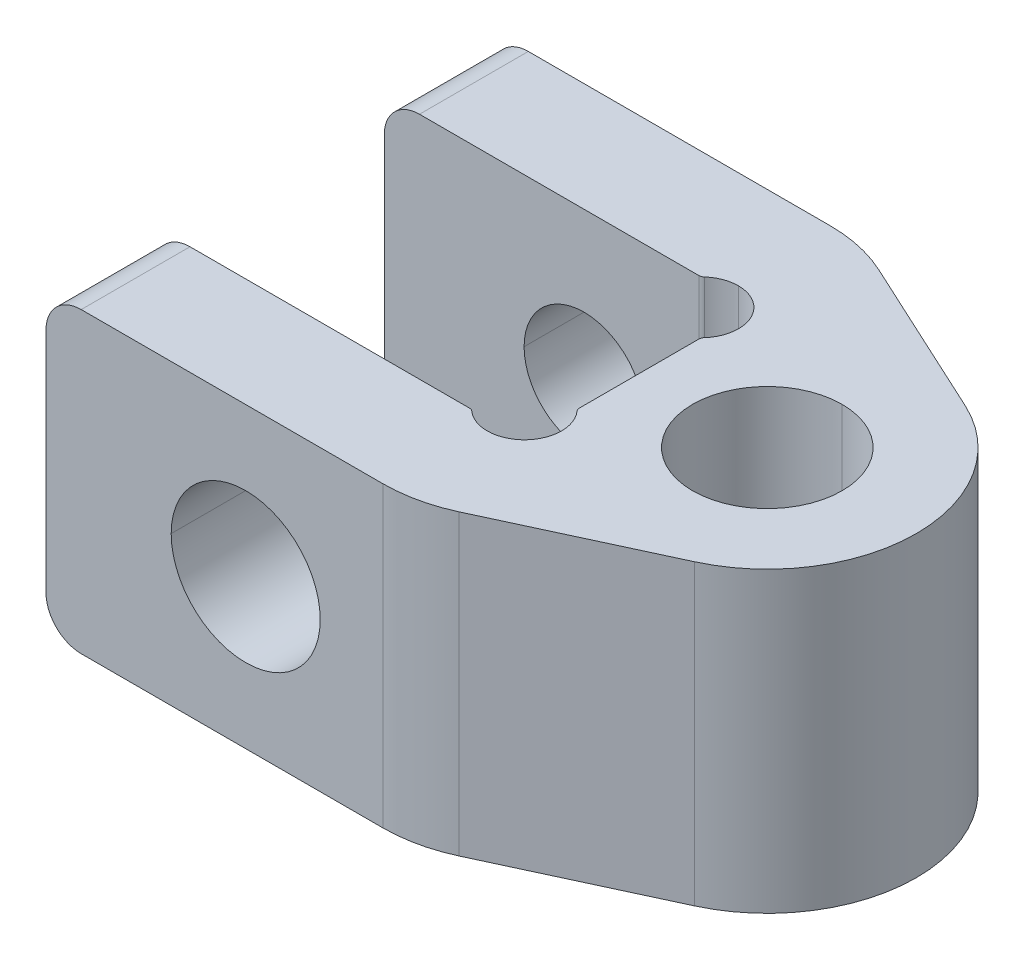
ISO-10303-21;
HEADER;
FILE_DESCRIPTION(('STEP AP214'),'2;1');
FILE_NAME('part.step','',(''),(''),'','','');
FILE_SCHEMA(('AUTOMOTIVE_DESIGN { 1 0 10303 214 1 1 1 1 }'));
ENDSEC;
DATA;
#1=APPLICATION_CONTEXT('core data for automotive mechanical design processes');
#2=APPLICATION_PROTOCOL_DEFINITION('international standard','automotive_design',2000,#1);
#3=PRODUCT_CONTEXT('',#1,'mechanical');
#4=PRODUCT('Part','Part','',(#3));
#5=PRODUCT_RELATED_PRODUCT_CATEGORY('part','',(#4));
#6=PRODUCT_DEFINITION_FORMATION('','',#4);
#7=PRODUCT_DEFINITION_CONTEXT('part definition',#1,'design');
#8=PRODUCT_DEFINITION('design','',#6,#7);
#9=PRODUCT_DEFINITION_SHAPE('','',#8);
#10=(LENGTH_UNIT() NAMED_UNIT(*) SI_UNIT(.MILLI.,.METRE.));
#11=(NAMED_UNIT(*) PLANE_ANGLE_UNIT() SI_UNIT($,.RADIAN.));
#12=(NAMED_UNIT(*) SI_UNIT($,.STERADIAN.) SOLID_ANGLE_UNIT());
#13=UNCERTAINTY_MEASURE_WITH_UNIT(LENGTH_MEASURE(1.E-05),#10,'distance_accuracy_value','');
#14=(GEOMETRIC_REPRESENTATION_CONTEXT(3) GLOBAL_UNCERTAINTY_ASSIGNED_CONTEXT((#13)) GLOBAL_UNIT_ASSIGNED_CONTEXT((#10,
#11,#12)) REPRESENTATION_CONTEXT('',''));
#15=CARTESIAN_POINT('',(0.,0.,0.));
#16=DIRECTION('',(0.,0.,1.));
#17=DIRECTION('',(1.,0.,0.));
#18=AXIS2_PLACEMENT_3D('',#15,#16,#17);
#19=CARTESIAN_POINT('',(0.,0.,-9.525));
#20=DIRECTION('',(0.,0.,-1.));
#21=DIRECTION('',(-1.,0.,0.));
#22=AXIS2_PLACEMENT_3D('',#19,#20,#21);
#23=CYLINDRICAL_SURFACE('',#22,2.5527);
#24=DIRECTION('',(0.,0.,-1.));
#25=VECTOR('',#24,1.);
#26=CARTESIAN_POINT('',(2.5527,0.,-9.525));
#27=LINE('',#26,#25);
#28=CARTESIAN_POINT('',(2.5527,0.,-4.8895));
#29=VERTEX_POINT('',#28);
#30=CARTESIAN_POINT('',(2.5527,0.,-9.525));
#31=VERTEX_POINT('',#30);
#32=EDGE_CURVE('E285',#29,#31,#27,.T.);
#33=ORIENTED_EDGE('',*,*,#32,.F.);
#34=CARTESIAN_POINT('',(0.,0.,-4.8895));
#35=DIRECTION('',(0.,0.,-1.));
#36=DIRECTION('',(-1.,0.,0.));
#37=AXIS2_PLACEMENT_3D('',#34,#35,#36);
#38=CIRCLE('',#37,2.5527);
#39=CARTESIAN_POINT('',(-2.5527,0.,-4.8895));
#40=VERTEX_POINT('',#39);
#41=EDGE_CURVE('E448',#40,#29,#38,.T.);
#42=ORIENTED_EDGE('',*,*,#41,.F.);
#43=DIRECTION('',(0.,0.,-1.));
#44=VECTOR('',#43,1.);
#45=CARTESIAN_POINT('',(-2.5527,0.,-9.525));
#46=LINE('',#45,#44);
#47=CARTESIAN_POINT('',(-2.5527,0.,-9.525));
#48=VERTEX_POINT('',#47);
#49=EDGE_CURVE('E352',#40,#48,#46,.T.);
#50=ORIENTED_EDGE('',*,*,#49,.T.);
#51=CARTESIAN_POINT('',(0.,0.,-9.525));
#52=DIRECTION('',(0.,0.,-1.));
#53=DIRECTION('',(-1.,0.,0.));
#54=AXIS2_PLACEMENT_3D('',#51,#52,#53);
#55=CIRCLE('',#54,2.5527);
#56=EDGE_CURVE('E259',#48,#31,#55,.T.);
#57=ORIENTED_EDGE('',*,*,#56,.T.);
#58=EDGE_LOOP('',(#33,#42,#50,#57));
#59=FACE_BOUND('',#58,.T.);
#60=ADVANCED_FACE('F16',(#59),#23,.F.);
#61=CARTESIAN_POINT('',(5.8406491909149,6.35,-3.175));
#62=DIRECTION('',(0.,-1.,0.));
#63=DIRECTION('',(0.,0.,-1.));
#64=AXIS2_PLACEMENT_3D('',#61,#62,#63);
#65=CYLINDRICAL_SURFACE('',#64,6.35);
#66=CARTESIAN_POINT('',(5.8406491909149,6.35,-3.175));
#67=DIRECTION('',(0.,1.,0.));
#68=DIRECTION('',(0.,0.,1.));
#69=AXIS2_PLACEMENT_3D('',#66,#67,#68);
#70=CIRCLE('',#69,6.35);
#71=CARTESIAN_POINT('',(8.50800118919866,6.35,-8.93761514568269));
#72=VERTEX_POINT('',#71);
#73=CARTESIAN_POINT('',(5.8406491909149,6.35,-9.525));
#74=VERTEX_POINT('',#73);
#75=EDGE_CURVE('E248',#72,#74,#70,.T.);
#76=ORIENTED_EDGE('',*,*,#75,.F.);
#77=DIRECTION('',(0.,1.,0.));
#78=VECTOR('',#77,1.);
#79=CARTESIAN_POINT('',(8.50800118919866,6.35,-8.93761514568269));
#80=LINE('',#79,#78);
#81=CARTESIAN_POINT('',(8.50800118919866,-6.35,-8.93761514568269));
#82=VERTEX_POINT('',#81);
#83=EDGE_CURVE('E20',#82,#72,#80,.T.);
#84=ORIENTED_EDGE('',*,*,#83,.F.);
#85=CARTESIAN_POINT('',(5.8406491909149,-6.35,-3.175));
#86=DIRECTION('',(0.,-1.,0.));
#87=DIRECTION('',(0.,0.,1.));
#88=AXIS2_PLACEMENT_3D('',#85,#86,#87);
#89=CIRCLE('',#88,6.35);
#90=CARTESIAN_POINT('',(5.8406491909149,-6.35,-9.525));
#91=VERTEX_POINT('',#90);
#92=EDGE_CURVE('E10',#91,#82,#89,.T.);
#93=ORIENTED_EDGE('',*,*,#92,.F.);
#94=DIRECTION('',(0.,-1.,0.));
#95=VECTOR('',#94,1.);
#96=CARTESIAN_POINT('',(5.8406491909149,6.35,-9.525));
#97=LINE('',#96,#95);
#98=EDGE_CURVE('E266',#74,#91,#97,.T.);
#99=ORIENTED_EDGE('',*,*,#98,.F.);
#100=EDGE_LOOP('',(#76,#84,#93,#99));
#101=FACE_BOUND('',#100,.T.);
#102=ADVANCED_FACE('F617',(#101),#65,.T.);
#103=CARTESIAN_POINT('',(5.84064919091489,6.35,3.175));
#104=DIRECTION('',(0.,-1.,0.));
#105=DIRECTION('',(0.,0.,-1.));
#106=AXIS2_PLACEMENT_3D('',#103,#104,#105);
#107=CYLINDRICAL_SURFACE('',#106,6.35);
#108=CARTESIAN_POINT('',(5.84064919091489,6.35,3.175));
#109=DIRECTION('',(0.,1.,0.));
#110=DIRECTION('',(0.,0.,1.));
#111=AXIS2_PLACEMENT_3D('',#108,#109,#110);
#112=CIRCLE('',#111,6.35);
#113=CARTESIAN_POINT('',(5.84064919091489,6.35,9.525));
#114=VERTEX_POINT('',#113);
#115=CARTESIAN_POINT('',(8.50800118919866,6.35,8.9376151456827));
#116=VERTEX_POINT('',#115);
#117=EDGE_CURVE('E197',#114,#116,#112,.T.);
#118=ORIENTED_EDGE('',*,*,#117,.F.);
#119=DIRECTION('',(0.,1.,0.));
#120=VECTOR('',#119,1.);
#121=CARTESIAN_POINT('',(5.84064919091489,6.35,9.525));
#122=LINE('',#121,#120);
#123=CARTESIAN_POINT('',(5.84064919091489,-6.35,9.525));
#124=VERTEX_POINT('',#123);
#125=EDGE_CURVE('E323',#124,#114,#122,.T.);
#126=ORIENTED_EDGE('',*,*,#125,.F.);
#127=CARTESIAN_POINT('',(5.84064919091489,-6.35,3.175));
#128=DIRECTION('',(0.,-1.,0.));
#129=DIRECTION('',(0.,0.,1.));
#130=AXIS2_PLACEMENT_3D('',#127,#128,#129);
#131=CIRCLE('',#130,6.35);
#132=CARTESIAN_POINT('',(8.50800118919866,-6.35,8.9376151456827));
#133=VERTEX_POINT('',#132);
#134=EDGE_CURVE('E212',#133,#124,#131,.T.);
#135=ORIENTED_EDGE('',*,*,#134,.F.);
#136=DIRECTION('',(0.,-1.,0.));
#137=VECTOR('',#136,1.);
#138=CARTESIAN_POINT('',(8.50800118919866,6.35,8.9376151456827));
#139=LINE('',#138,#137);
#140=EDGE_CURVE('E412',#116,#133,#139,.T.);
#141=ORIENTED_EDGE('',*,*,#140,.F.);
#142=EDGE_LOOP('',(#118,#126,#135,#141));
#143=FACE_BOUND('',#142,.T.);
#144=ADVANCED_FACE('F549',(#143),#107,.T.);
#145=CARTESIAN_POINT('',(7.489,6.35,-2.54526338987083));
#146=DIRECTION('',(0.,-1.,0.));
#147=DIRECTION('',(0.,0.,-1.));
#148=AXIS2_PLACEMENT_3D('',#145,#146,#147);
#149=CYLINDRICAL_SURFACE('',#148,0.25);
#150=CARTESIAN_POINT('',(7.489,6.35,-2.54526338987083));
#151=DIRECTION('',(0.,1.,0.));
#152=DIRECTION('',(0.,0.,1.));
#153=AXIS2_PLACEMENT_3D('',#150,#151,#152);
#154=CIRCLE('',#153,0.25);
#155=CARTESIAN_POINT('',(7.30226095032195,6.35,-2.71148170211512));
#156=VERTEX_POINT('',#155);
#157=CARTESIAN_POINT('',(7.239,6.35,-2.54526338987083));
#158=VERTEX_POINT('',#157);
#159=EDGE_CURVE('E42',#156,#158,#154,.T.);
#160=ORIENTED_EDGE('',*,*,#159,.F.);
#161=DIRECTION('',(0.,1.,0.));
#162=VECTOR('',#161,1.);
#163=CARTESIAN_POINT('',(7.30226095032195,6.35,-2.71148170211512));
#164=LINE('',#163,#162);
#165=CARTESIAN_POINT('',(7.30226095032195,-6.35,-2.71148170211512));
#166=VERTEX_POINT('',#165);
#167=EDGE_CURVE('E290',#166,#156,#164,.T.);
#168=ORIENTED_EDGE('',*,*,#167,.F.);
#169=CARTESIAN_POINT('',(7.489,-6.35,-2.54526338987083));
#170=DIRECTION('',(0.,-1.,0.));
#171=DIRECTION('',(0.,0.,1.));
#172=AXIS2_PLACEMENT_3D('',#169,#170,#171);
#173=CIRCLE('',#172,0.25);
#174=CARTESIAN_POINT('',(7.239,-6.35,-2.54526338987083));
#175=VERTEX_POINT('',#174);
#176=EDGE_CURVE('E392',#175,#166,#173,.T.);
#177=ORIENTED_EDGE('',*,*,#176,.F.);
#178=DIRECTION('',(0.,-1.,0.));
#179=VECTOR('',#178,1.);
#180=CARTESIAN_POINT('',(7.239,-6.35,-2.54526338987083));
#181=LINE('',#180,#179);
#182=EDGE_CURVE('E289',#158,#175,#181,.T.);
#183=ORIENTED_EDGE('',*,*,#182,.F.);
#184=EDGE_LOOP('',(#160,#168,#177,#183));
#185=FACE_BOUND('',#184,.T.);
#186=ADVANCED_FACE('F1001',(#185),#149,.T.);
#187=CARTESIAN_POINT('',(7.489,6.35,2.54526338987083));
#188=DIRECTION('',(0.,-1.,0.));
#189=DIRECTION('',(0.,0.,-1.));
#190=AXIS2_PLACEMENT_3D('',#187,#188,#189);
#191=CYLINDRICAL_SURFACE('',#190,0.25);
#192=CARTESIAN_POINT('',(7.489,6.35,2.54526338987083));
#193=DIRECTION('',(0.,1.,0.));
#194=DIRECTION('',(0.,0.,1.));
#195=AXIS2_PLACEMENT_3D('',#192,#193,#194);
#196=CIRCLE('',#195,0.25);
#197=CARTESIAN_POINT('',(7.239,6.35,2.54526338987083));
#198=VERTEX_POINT('',#197);
#199=CARTESIAN_POINT('',(7.30226095032195,6.35,2.71148170211512));
#200=VERTEX_POINT('',#199);
#201=EDGE_CURVE('E383',#198,#200,#196,.T.);
#202=ORIENTED_EDGE('',*,*,#201,.F.);
#203=DIRECTION('',(0.,1.,0.));
#204=VECTOR('',#203,1.);
#205=CARTESIAN_POINT('',(7.239,6.35,2.54526338987083));
#206=LINE('',#205,#204);
#207=CARTESIAN_POINT('',(7.239,-6.35,2.54526338987083));
#208=VERTEX_POINT('',#207);
#209=EDGE_CURVE('E480',#208,#198,#206,.T.);
#210=ORIENTED_EDGE('',*,*,#209,.F.);
#211=CARTESIAN_POINT('',(7.489,-6.35,2.54526338987083));
#212=DIRECTION('',(0.,-1.,0.));
#213=DIRECTION('',(0.,0.,1.));
#214=AXIS2_PLACEMENT_3D('',#211,#212,#213);
#215=CIRCLE('',#214,0.25);
#216=CARTESIAN_POINT('',(7.30226095032195,-6.35,2.71148170211512));
#217=VERTEX_POINT('',#216);
#218=EDGE_CURVE('E416',#217,#208,#215,.T.);
#219=ORIENTED_EDGE('',*,*,#218,.F.);
#220=DIRECTION('',(0.,-1.,0.));
#221=VECTOR('',#220,1.);
#222=CARTESIAN_POINT('',(7.30226095032195,6.35,2.71148170211512));
#223=LINE('',#222,#221);
#224=EDGE_CURVE('E423',#200,#217,#223,.T.);
#225=ORIENTED_EDGE('',*,*,#224,.F.);
#226=EDGE_LOOP('',(#202,#210,#219,#225));
#227=FACE_BOUND('',#226,.T.);
#228=ADVANCED_FACE('F997',(#227),#191,.T.);
#229=CARTESIAN_POINT('',(4.89476338987083,6.35,-5.1395));
#230=DIRECTION('',(0.,-1.,0.));
#231=DIRECTION('',(0.,0.,-1.));
#232=AXIS2_PLACEMENT_3D('',#229,#230,#231);
#233=CYLINDRICAL_SURFACE('',#232,0.25);
#234=CARTESIAN_POINT('',(4.89476338987083,6.35,-5.1395));
#235=DIRECTION('',(0.,1.,0.));
#236=DIRECTION('',(0.,0.,1.));
#237=AXIS2_PLACEMENT_3D('',#234,#235,#236);
#238=CIRCLE('',#237,0.25);
#239=CARTESIAN_POINT('',(4.89476338987083,6.35,-4.8895));
#240=VERTEX_POINT('',#239);
#241=CARTESIAN_POINT('',(5.06098170211512,6.35,-4.95276095032195));
#242=VERTEX_POINT('',#241);
#243=EDGE_CURVE('E247',#240,#242,#238,.T.);
#244=ORIENTED_EDGE('',*,*,#243,.F.);
#245=DIRECTION('',(0.,1.,0.));
#246=VECTOR('',#245,1.);
#247=CARTESIAN_POINT('',(4.89476338987083,6.35,-4.8895));
#248=LINE('',#247,#246);
#249=CARTESIAN_POINT('',(4.89476338987083,-6.35,-4.8895));
#250=VERTEX_POINT('',#249);
#251=EDGE_CURVE('E351',#250,#240,#248,.T.);
#252=ORIENTED_EDGE('',*,*,#251,.F.);
#253=CARTESIAN_POINT('',(4.89476338987083,-6.35,-5.1395));
#254=DIRECTION('',(0.,-1.,0.));
#255=DIRECTION('',(0.,0.,1.));
#256=AXIS2_PLACEMENT_3D('',#253,#254,#255);
#257=CIRCLE('',#256,0.25);
#258=CARTESIAN_POINT('',(5.06098170211512,-6.35,-4.95276095032195));
#259=VERTEX_POINT('',#258);
#260=EDGE_CURVE('E389',#259,#250,#257,.T.);
#261=ORIENTED_EDGE('',*,*,#260,.F.);
#262=DIRECTION('',(0.,-1.,0.));
#263=VECTOR('',#262,1.);
#264=CARTESIAN_POINT('',(5.06098170211512,6.35,-4.95276095032195));
#265=LINE('',#264,#263);
#266=EDGE_CURVE('E473',#242,#259,#265,.T.);
#267=ORIENTED_EDGE('',*,*,#266,.F.);
#268=EDGE_LOOP('',(#244,#252,#261,#267));
#269=FACE_BOUND('',#268,.T.);
#270=ADVANCED_FACE('F938',(#269),#233,.T.);
#271=CARTESIAN_POINT('',(4.89476338987083,6.35,5.1395));
#272=DIRECTION('',(0.,-1.,0.));
#273=DIRECTION('',(0.,0.,-1.));
#274=AXIS2_PLACEMENT_3D('',#271,#272,#273);
#275=CYLINDRICAL_SURFACE('',#274,0.25);
#276=CARTESIAN_POINT('',(4.89476338987083,6.35,5.1395));
#277=DIRECTION('',(0.,1.,0.));
#278=DIRECTION('',(0.,0.,1.));
#279=AXIS2_PLACEMENT_3D('',#276,#277,#278);
#280=CIRCLE('',#279,0.25);
#281=CARTESIAN_POINT('',(5.06098170211512,6.35,4.95276095032195));
#282=VERTEX_POINT('',#281);
#283=CARTESIAN_POINT('',(4.89476338987083,6.35,4.8895));
#284=VERTEX_POINT('',#283);
#285=EDGE_CURVE('E379',#282,#284,#280,.T.);
#286=ORIENTED_EDGE('',*,*,#285,.F.);
#287=DIRECTION('',(0.,1.,0.));
#288=VECTOR('',#287,1.);
#289=CARTESIAN_POINT('',(5.06098170211512,6.35,4.95276095032195));
#290=LINE('',#289,#288);
#291=CARTESIAN_POINT('',(5.06098170211512,-6.35,4.95276095032195));
#292=VERTEX_POINT('',#291);
#293=EDGE_CURVE('E304',#292,#282,#290,.T.);
#294=ORIENTED_EDGE('',*,*,#293,.F.);
#295=CARTESIAN_POINT('',(4.89476338987083,-6.35,5.1395));
#296=DIRECTION('',(0.,-1.,0.));
#297=DIRECTION('',(0.,0.,1.));
#298=AXIS2_PLACEMENT_3D('',#295,#296,#297);
#299=CIRCLE('',#298,0.25);
#300=CARTESIAN_POINT('',(4.89476338987083,-6.35,4.8895));
#301=VERTEX_POINT('',#300);
#302=EDGE_CURVE('E452',#301,#292,#299,.T.);
#303=ORIENTED_EDGE('',*,*,#302,.F.);
#304=DIRECTION('',(0.,-1.,0.));
#305=VECTOR('',#304,1.);
#306=CARTESIAN_POINT('',(4.89476338987083,-6.35,4.8895));
#307=LINE('',#306,#305);
#308=EDGE_CURVE('E393',#284,#301,#307,.T.);
#309=ORIENTED_EDGE('',*,*,#308,.F.);
#310=EDGE_LOOP('',(#286,#294,#303,#309));
#311=FACE_BOUND('',#310,.T.);
#312=ADVANCED_FACE('F933',(#311),#275,.T.);
#313=CARTESIAN_POINT('',(-7.009,4.85,0.));
#314=DIRECTION('',(0.,0.,-1.));
#315=DIRECTION('',(-1.,0.,0.));
#316=AXIS2_PLACEMENT_3D('',#313,#314,#315);
#317=CYLINDRICAL_SURFACE('',#316,1.5);
#318=CARTESIAN_POINT('',(-7.009,4.85,-9.525));
#319=DIRECTION('',(0.,0.,-1.));
#320=DIRECTION('',(1.,0.,0.));
#321=AXIS2_PLACEMENT_3D('',#318,#319,#320);
#322=CIRCLE('',#321,1.5);
#323=CARTESIAN_POINT('',(-8.509,4.85,-9.525));
#324=VERTEX_POINT('',#323);
#325=CARTESIAN_POINT('',(-7.009,6.35,-9.525));
#326=VERTEX_POINT('',#325);
#327=EDGE_CURVE('E239',#324,#326,#322,.T.);
#328=ORIENTED_EDGE('',*,*,#327,.F.);
#329=DIRECTION('',(0.,0.,-1.));
#330=VECTOR('',#329,1.);
#331=CARTESIAN_POINT('',(-8.509,4.85,-9.525));
#332=LINE('',#331,#330);
#333=CARTESIAN_POINT('',(-8.509,4.85,-4.8895));
#334=VERTEX_POINT('',#333);
#335=EDGE_CURVE('E440',#334,#324,#332,.T.);
#336=ORIENTED_EDGE('',*,*,#335,.F.);
#337=CARTESIAN_POINT('',(-7.009,4.85,-4.8895));
#338=DIRECTION('',(0.,0.,1.));
#339=DIRECTION('',(-1.,0.,0.));
#340=AXIS2_PLACEMENT_3D('',#337,#338,#339);
#341=CIRCLE('',#340,1.5);
#342=CARTESIAN_POINT('',(-7.009,6.35,-4.8895));
#343=VERTEX_POINT('',#342);
#344=EDGE_CURVE('E242',#343,#334,#341,.T.);
#345=ORIENTED_EDGE('',*,*,#344,.F.);
#346=DIRECTION('',(0.,0.,1.));
#347=VECTOR('',#346,1.);
#348=CARTESIAN_POINT('',(-7.009,6.35,-4.8895));
#349=LINE('',#348,#347);
#350=EDGE_CURVE('E235',#326,#343,#349,.T.);
#351=ORIENTED_EDGE('',*,*,#350,.F.);
#352=EDGE_LOOP('',(#328,#336,#345,#351));
#353=FACE_BOUND('',#352,.T.);
#354=ADVANCED_FACE('F237',(#353),#317,.T.);
#355=CARTESIAN_POINT('',(-7.009,-4.85,0.));
#356=DIRECTION('',(0.,0.,1.));
#357=DIRECTION('',(1.,0.,0.));
#358=AXIS2_PLACEMENT_3D('',#355,#356,#357);
#359=CYLINDRICAL_SURFACE('',#358,1.5);
#360=CARTESIAN_POINT('',(-7.009,-4.85,-9.525));
#361=DIRECTION('',(0.,0.,-1.));
#362=DIRECTION('',(1.,0.,0.));
#363=AXIS2_PLACEMENT_3D('',#360,#361,#362);
#364=CIRCLE('',#363,1.5);
#365=CARTESIAN_POINT('',(-7.009,-6.35,-9.525));
#366=VERTEX_POINT('',#365);
#367=CARTESIAN_POINT('',(-8.509,-4.85,-9.525));
#368=VERTEX_POINT('',#367);
#369=EDGE_CURVE('E346',#366,#368,#364,.T.);
#370=ORIENTED_EDGE('',*,*,#369,.F.);
#371=DIRECTION('',(0.,0.,-1.));
#372=VECTOR('',#371,1.);
#373=CARTESIAN_POINT('',(-7.009,-6.35,0.));
#374=LINE('',#373,#372);
#375=CARTESIAN_POINT('',(-7.009,-6.35,-4.8895));
#376=VERTEX_POINT('',#375);
#377=EDGE_CURVE('E27',#376,#366,#374,.T.);
#378=ORIENTED_EDGE('',*,*,#377,.F.);
#379=CARTESIAN_POINT('',(-7.009,-4.85,-4.8895));
#380=DIRECTION('',(0.,0.,1.));
#381=DIRECTION('',(-1.,0.,0.));
#382=AXIS2_PLACEMENT_3D('',#379,#380,#381);
#383=CIRCLE('',#382,1.5);
#384=CARTESIAN_POINT('',(-8.509,-4.85,-4.8895));
#385=VERTEX_POINT('',#384);
#386=EDGE_CURVE('E326',#385,#376,#383,.T.);
#387=ORIENTED_EDGE('',*,*,#386,.F.);
#388=DIRECTION('',(0.,0.,1.));
#389=VECTOR('',#388,1.);
#390=CARTESIAN_POINT('',(-8.509,-4.85,0.));
#391=LINE('',#390,#389);
#392=EDGE_CURVE('E328',#368,#385,#391,.T.);
#393=ORIENTED_EDGE('',*,*,#392,.F.);
#394=EDGE_LOOP('',(#370,#378,#387,#393));
#395=FACE_BOUND('',#394,.T.);
#396=ADVANCED_FACE('F595',(#395),#359,.T.);
#397=CARTESIAN_POINT('',(-7.009,4.85,0.));
#398=DIRECTION('',(0.,0.,-1.));
#399=DIRECTION('',(-1.,0.,0.));
#400=AXIS2_PLACEMENT_3D('',#397,#398,#399);
#401=CYLINDRICAL_SURFACE('',#400,1.5);
#402=CARTESIAN_POINT('',(-7.009,4.85,4.8895));
#403=DIRECTION('',(0.,0.,-1.));
#404=DIRECTION('',(1.,0.,0.));
#405=AXIS2_PLACEMENT_3D('',#402,#403,#404);
#406=CIRCLE('',#405,1.5);
#407=CARTESIAN_POINT('',(-8.509,4.85,4.8895));
#408=VERTEX_POINT('',#407);
#409=CARTESIAN_POINT('',(-7.009,6.35,4.8895));
#410=VERTEX_POINT('',#409);
#411=EDGE_CURVE('E401',#408,#410,#406,.T.);
#412=ORIENTED_EDGE('',*,*,#411,.F.);
#413=DIRECTION('',(0.,0.,-1.));
#414=VECTOR('',#413,1.);
#415=CARTESIAN_POINT('',(-8.509,4.85,4.8895));
#416=LINE('',#415,#414);
#417=CARTESIAN_POINT('',(-8.509,4.85,9.525));
#418=VERTEX_POINT('',#417);
#419=EDGE_CURVE('E388',#418,#408,#416,.T.);
#420=ORIENTED_EDGE('',*,*,#419,.F.);
#421=CARTESIAN_POINT('',(-7.009,4.85,9.525));
#422=DIRECTION('',(0.,0.,1.));
#423=DIRECTION('',(-1.,0.,0.));
#424=AXIS2_PLACEMENT_3D('',#421,#422,#423);
#425=CIRCLE('',#424,1.5);
#426=CARTESIAN_POINT('',(-7.009,6.35,9.525));
#427=VERTEX_POINT('',#426);
#428=EDGE_CURVE('E322',#427,#418,#425,.T.);
#429=ORIENTED_EDGE('',*,*,#428,.F.);
#430=DIRECTION('',(0.,0.,1.));
#431=VECTOR('',#430,1.);
#432=CARTESIAN_POINT('',(-7.009,6.35,9.525));
#433=LINE('',#432,#431);
#434=EDGE_CURVE('E382',#410,#427,#433,.T.);
#435=ORIENTED_EDGE('',*,*,#434,.F.);
#436=EDGE_LOOP('',(#412,#420,#429,#435));
#437=FACE_BOUND('',#436,.T.);
#438=ADVANCED_FACE('F543',(#437),#401,.T.);
#439=CARTESIAN_POINT('',(-7.009,-4.85,0.));
#440=DIRECTION('',(0.,0.,1.));
#441=DIRECTION('',(1.,0.,0.));
#442=AXIS2_PLACEMENT_3D('',#439,#440,#441);
#443=CYLINDRICAL_SURFACE('',#442,1.5);
#444=CARTESIAN_POINT('',(-7.009,-4.85,4.8895));
#445=DIRECTION('',(0.,0.,-1.));
#446=DIRECTION('',(1.,0.,0.));
#447=AXIS2_PLACEMENT_3D('',#444,#445,#446);
#448=CIRCLE('',#447,1.5);
#449=CARTESIAN_POINT('',(-7.009,-6.35,4.8895));
#450=VERTEX_POINT('',#449);
#451=CARTESIAN_POINT('',(-8.509,-4.85,4.8895));
#452=VERTEX_POINT('',#451);
#453=EDGE_CURVE('E358',#450,#452,#448,.T.);
#454=ORIENTED_EDGE('',*,*,#453,.F.);
#455=DIRECTION('',(0.,0.,-1.));
#456=VECTOR('',#455,1.);
#457=CARTESIAN_POINT('',(-7.009,-6.35,0.));
#458=LINE('',#457,#456);
#459=CARTESIAN_POINT('',(-7.009,-6.35,9.525));
#460=VERTEX_POINT('',#459);
#461=EDGE_CURVE('E404',#460,#450,#458,.T.);
#462=ORIENTED_EDGE('',*,*,#461,.F.);
#463=CARTESIAN_POINT('',(-7.009,-4.85,9.525));
#464=DIRECTION('',(0.,0.,1.));
#465=DIRECTION('',(-1.,0.,0.));
#466=AXIS2_PLACEMENT_3D('',#463,#464,#465);
#467=CIRCLE('',#466,1.5);
#468=CARTESIAN_POINT('',(-8.509,-4.85,9.525));
#469=VERTEX_POINT('',#468);
#470=EDGE_CURVE('E505',#469,#460,#467,.T.);
#471=ORIENTED_EDGE('',*,*,#470,.F.);
#472=DIRECTION('',(0.,0.,1.));
#473=VECTOR('',#472,1.);
#474=CARTESIAN_POINT('',(-8.509,-4.85,0.));
#475=LINE('',#474,#473);
#476=EDGE_CURVE('E438',#452,#469,#475,.T.);
#477=ORIENTED_EDGE('',*,*,#476,.F.);
#478=EDGE_LOOP('',(#454,#462,#471,#477));
#479=FACE_BOUND('',#478,.T.);
#480=ADVANCED_FACE('F1009',(#479),#443,.T.);
#481=CARTESIAN_POINT('',(0.,0.,-9.526));
#482=DIRECTION('',(0.,0.,1.));
#483=DIRECTION('',(1.,0.,0.));
#484=AXIS2_PLACEMENT_3D('',#481,#482,#483);
#485=CYLINDRICAL_SURFACE('',#484,3.175);
#486=DIRECTION('',(0.,0.,1.));
#487=VECTOR('',#486,1.);
#488=CARTESIAN_POINT('',(-3.175,0.,-9.526));
#489=LINE('',#488,#487);
#490=CARTESIAN_POINT('',(-3.175,0.,4.8895));
#491=VERTEX_POINT('',#490);
#492=CARTESIAN_POINT('',(-3.175,0.,9.525));
#493=VERTEX_POINT('',#492);
#494=EDGE_CURVE('E364',#491,#493,#489,.T.);
#495=ORIENTED_EDGE('',*,*,#494,.F.);
#496=CARTESIAN_POINT('',(0.,0.,4.8895));
#497=DIRECTION('',(0.,0.,-1.));
#498=DIRECTION('',(1.,0.,0.));
#499=AXIS2_PLACEMENT_3D('',#496,#497,#498);
#500=CIRCLE('',#499,3.175);
#501=CARTESIAN_POINT('',(3.175,0.,4.8895));
#502=VERTEX_POINT('',#501);
#503=EDGE_CURVE('E501',#491,#502,#500,.T.);
#504=ORIENTED_EDGE('',*,*,#503,.T.);
#505=DIRECTION('',(0.,0.,1.));
#506=VECTOR('',#505,1.);
#507=CARTESIAN_POINT('',(3.175,0.,-9.526));
#508=LINE('',#507,#506);
#509=CARTESIAN_POINT('',(3.175,0.,9.525));
#510=VERTEX_POINT('',#509);
#511=EDGE_CURVE('E374',#502,#510,#508,.T.);
#512=ORIENTED_EDGE('',*,*,#511,.T.);
#513=CARTESIAN_POINT('',(0.,0.,9.525));
#514=DIRECTION('',(0.,0.,1.));
#515=DIRECTION('',(1.,0.,0.));
#516=AXIS2_PLACEMENT_3D('',#513,#514,#515);
#517=CIRCLE('',#516,3.175);
#518=EDGE_CURVE('E413',#510,#493,#517,.T.);
#519=ORIENTED_EDGE('',*,*,#518,.T.);
#520=EDGE_LOOP('',(#495,#504,#512,#519));
#521=FACE_BOUND('',#520,.T.);
#522=ADVANCED_FACE('F1013',(#521),#485,.F.);
#523=CARTESIAN_POINT('',(0.,-6.35,0.));
#524=DIRECTION('',(0.,1.,0.));
#525=DIRECTION('',(1.,0.,0.));
#526=AXIS2_PLACEMENT_3D('',#523,#524,#525);
#527=PLANE('',#526);
#528=CARTESIAN_POINT('',(12.7,-6.35,0.));
#529=DIRECTION('',(0.,1.,0.));
#530=DIRECTION('',(0.,0.,1.));
#531=AXIS2_PLACEMENT_3D('',#528,#529,#530);
#532=CIRCLE('',#531,3.1877);
#533=CARTESIAN_POINT('',(12.7,-6.35,-3.1877));
#534=VERTEX_POINT('',#533);
#535=CARTESIAN_POINT('',(12.7,-6.35,3.1877));
#536=VERTEX_POINT('',#535);
#537=EDGE_CURVE('E279',#534,#536,#532,.T.);
#538=ORIENTED_EDGE('',*,*,#537,.T.);
#539=CARTESIAN_POINT('',(12.7,-6.35,0.));
#540=DIRECTION('',(0.,1.,0.));
#541=DIRECTION('',(0.,0.,1.));
#542=AXIS2_PLACEMENT_3D('',#539,#540,#541);
#543=CIRCLE('',#542,3.1877);
#544=EDGE_CURVE('E288',#536,#534,#543,.T.);
#545=ORIENTED_EDGE('',*,*,#544,.T.);
#546=EDGE_LOOP('',(#538,#545));
#547=FACE_BOUND('',#546,.T.);
#548=DIRECTION('',(0.907498448139007,0.,-0.420055432800593));
#549=VECTOR('',#548,1.);
#550=CARTESIAN_POINT('',(4.908223394425,-6.35,10.6038507438487));
#551=LINE('',#550,#549);
#552=CARTESIAN_POINT('',(15.3673519982838,-6.35,5.7626151456827));
#553=VERTEX_POINT('',#552);
#554=EDGE_CURVE('E340',#133,#553,#551,.T.);
#555=ORIENTED_EDGE('',*,*,#554,.F.);
#556=ORIENTED_EDGE('',*,*,#134,.T.);
#557=DIRECTION('',(1.,0.,0.));
#558=VECTOR('',#557,1.);
#559=CARTESIAN_POINT('',(0.,-6.35,9.525));
#560=LINE('',#559,#558);
#561=EDGE_CURVE('E384',#460,#124,#560,.T.);
#562=ORIENTED_EDGE('',*,*,#561,.F.);
#563=ORIENTED_EDGE('',*,*,#461,.T.);
#564=DIRECTION('',(-1.,0.,0.));
#565=VECTOR('',#564,1.);
#566=CARTESIAN_POINT('',(0.,-6.35,4.8895));
#567=LINE('',#566,#565);
#568=EDGE_CURVE('E363',#301,#450,#567,.T.);
#569=ORIENTED_EDGE('',*,*,#568,.F.);
#570=ORIENTED_EDGE('',*,*,#302,.T.);
#571=CARTESIAN_POINT('',(6.11646798486636,-6.35,3.76696798486636));
#572=DIRECTION('',(0.,1.,0.));
#573=DIRECTION('',(0.,0.,1.));
#574=AXIS2_PLACEMENT_3D('',#571,#572,#573);
#575=CIRCLE('',#574,1.5875);
#576=EDGE_CURVE('E293',#292,#217,#575,.T.);
#577=ORIENTED_EDGE('',*,*,#576,.T.);
#578=ORIENTED_EDGE('',*,*,#218,.T.);
#579=DIRECTION('',(0.,0.,1.));
#580=VECTOR('',#579,1.);
#581=CARTESIAN_POINT('',(7.239,-6.35,0.));
#582=LINE('',#581,#580);
#583=EDGE_CURVE('E485',#175,#208,#582,.T.);
#584=ORIENTED_EDGE('',*,*,#583,.F.);
#585=ORIENTED_EDGE('',*,*,#176,.T.);
#586=CARTESIAN_POINT('',(6.11646798486636,-6.35,-3.76696798486636));
#587=DIRECTION('',(0.,1.,0.));
#588=DIRECTION('',(0.,0.,1.));
#589=AXIS2_PLACEMENT_3D('',#586,#587,#588);
#590=CIRCLE('',#589,1.5875);
#591=CARTESIAN_POINT('',(6.11646798486636,-6.35,-5.35446798486636));
#592=VERTEX_POINT('',#591);
#593=EDGE_CURVE('E294',#166,#592,#590,.T.);
#594=ORIENTED_EDGE('',*,*,#593,.T.);
#595=CARTESIAN_POINT('',(6.11646798486636,-6.35,-3.76696798486636));
#596=DIRECTION('',(0.,1.,0.));
#597=DIRECTION('',(0.,0.,1.));
#598=AXIS2_PLACEMENT_3D('',#595,#596,#597);
#599=CIRCLE('',#598,1.5875);
#600=EDGE_CURVE('E512',#592,#259,#599,.T.);
#601=ORIENTED_EDGE('',*,*,#600,.T.);
#602=ORIENTED_EDGE('',*,*,#260,.T.);
#603=DIRECTION('',(1.,0.,0.));
#604=VECTOR('',#603,1.);
#605=CARTESIAN_POINT('',(0.,-6.35,-4.8895));
#606=LINE('',#605,#604);
#607=EDGE_CURVE('E444',#376,#250,#606,.T.);
#608=ORIENTED_EDGE('',*,*,#607,.F.);
#609=ORIENTED_EDGE('',*,*,#377,.T.);
#610=DIRECTION('',(-1.,0.,0.));
#611=VECTOR('',#610,1.);
#612=CARTESIAN_POINT('',(0.,-6.35,-9.525));
#613=LINE('',#612,#611);
#614=EDGE_CURVE('E274',#91,#366,#613,.T.);
#615=ORIENTED_EDGE('',*,*,#614,.F.);
#616=ORIENTED_EDGE('',*,*,#92,.T.);
#617=DIRECTION('',(-0.907498448139007,0.,-0.420055432800593));
#618=VECTOR('',#617,1.);
#619=CARTESIAN_POINT('',(4.908223394425,-6.35,-10.6038507438487));
#620=LINE('',#619,#618);
#621=CARTESIAN_POINT('',(15.3673519982838,-6.35,-5.7626151456827));
#622=VERTEX_POINT('',#621);
#623=EDGE_CURVE('E341',#622,#82,#620,.T.);
#624=ORIENTED_EDGE('',*,*,#623,.F.);
#625=CARTESIAN_POINT('',(12.7,-6.35,0.));
#626=DIRECTION('',(0.,1.,0.));
#627=DIRECTION('',(0.,0.,1.));
#628=AXIS2_PLACEMENT_3D('',#625,#626,#627);
#629=CIRCLE('',#628,6.35);
#630=EDGE_CURVE('E339',#553,#622,#629,.T.);
#631=ORIENTED_EDGE('',*,*,#630,.F.);
#632=EDGE_LOOP('',(#555,#556,#562,#563,#569,#570,#577,#578,#584,#585,#594,#601,#602,#608,#609,
#615,#616,#624,#631));
#633=FACE_BOUND('',#632,.T.);
#634=ADVANCED_FACE('F18',(#547,#633),#527,.F.);
#635=CARTESIAN_POINT('',(0.,6.35,0.));
#636=DIRECTION('',(0.,1.,0.));
#637=DIRECTION('',(1.,0.,0.));
#638=AXIS2_PLACEMENT_3D('',#635,#636,#637);
#639=PLANE('',#638);
#640=CARTESIAN_POINT('',(12.7,6.35,0.));
#641=DIRECTION('',(0.,1.,0.));
#642=DIRECTION('',(0.,0.,1.));
#643=AXIS2_PLACEMENT_3D('',#640,#641,#642);
#644=CIRCLE('',#643,3.1877);
#645=CARTESIAN_POINT('',(12.7,6.35,-3.1877));
#646=VERTEX_POINT('',#645);
#647=CARTESIAN_POINT('',(12.7,6.35,3.1877));
#648=VERTEX_POINT('',#647);
#649=EDGE_CURVE('E369',#646,#648,#644,.T.);
#650=ORIENTED_EDGE('',*,*,#649,.F.);
#651=CARTESIAN_POINT('',(12.7,6.35,0.));
#652=DIRECTION('',(0.,1.,0.));
#653=DIRECTION('',(0.,0.,1.));
#654=AXIS2_PLACEMENT_3D('',#651,#652,#653);
#655=CIRCLE('',#654,3.1877);
#656=EDGE_CURVE('E286',#648,#646,#655,.T.);
#657=ORIENTED_EDGE('',*,*,#656,.F.);
#658=EDGE_LOOP('',(#650,#657));
#659=FACE_BOUND('',#658,.T.);
#660=DIRECTION('',(1.,0.,0.));
#661=VECTOR('',#660,1.);
#662=CARTESIAN_POINT('',(0.,6.35,9.525));
#663=LINE('',#662,#661);
#664=EDGE_CURVE('E319',#427,#114,#663,.T.);
#665=ORIENTED_EDGE('',*,*,#664,.T.);
#666=ORIENTED_EDGE('',*,*,#117,.T.);
#667=DIRECTION('',(0.907498448139007,0.,-0.420055432800593));
#668=VECTOR('',#667,1.);
#669=CARTESIAN_POINT('',(4.908223394425,6.35,10.6038507438487));
#670=LINE('',#669,#668);
#671=CARTESIAN_POINT('',(15.3673519982838,6.35,5.7626151456827));
#672=VERTEX_POINT('',#671);
#673=EDGE_CURVE('E408',#116,#672,#670,.T.);
#674=ORIENTED_EDGE('',*,*,#673,.T.);
#675=CARTESIAN_POINT('',(12.7,6.35,0.));
#676=DIRECTION('',(0.,1.,0.));
#677=DIRECTION('',(0.,0.,1.));
#678=AXIS2_PLACEMENT_3D('',#675,#676,#677);
#679=CIRCLE('',#678,6.35);
#680=CARTESIAN_POINT('',(15.3673519982838,6.35,-5.7626151456827));
#681=VERTEX_POINT('',#680);
#682=EDGE_CURVE('E345',#672,#681,#679,.T.);
#683=ORIENTED_EDGE('',*,*,#682,.T.);
#684=DIRECTION('',(-0.907498448139007,0.,-0.420055432800593));
#685=VECTOR('',#684,1.);
#686=CARTESIAN_POINT('',(4.908223394425,6.35,-10.6038507438487));
#687=LINE('',#686,#685);
#688=EDGE_CURVE('E267',#681,#72,#687,.T.);
#689=ORIENTED_EDGE('',*,*,#688,.T.);
#690=ORIENTED_EDGE('',*,*,#75,.T.);
#691=DIRECTION('',(-1.,0.,0.));
#692=VECTOR('',#691,1.);
#693=CARTESIAN_POINT('',(0.,6.35,-9.525));
#694=LINE('',#693,#692);
#695=EDGE_CURVE('E254',#74,#326,#694,.T.);
#696=ORIENTED_EDGE('',*,*,#695,.T.);
#697=ORIENTED_EDGE('',*,*,#350,.T.);
#698=DIRECTION('',(1.,0.,0.));
#699=VECTOR('',#698,1.);
#700=CARTESIAN_POINT('',(0.,6.35,-4.8895));
#701=LINE('',#700,#699);
#702=EDGE_CURVE('E327',#343,#240,#701,.T.);
#703=ORIENTED_EDGE('',*,*,#702,.T.);
#704=ORIENTED_EDGE('',*,*,#243,.T.);
#705=CARTESIAN_POINT('',(6.11646798486636,6.35,-3.76696798486636));
#706=DIRECTION('',(0.,1.,0.));
#707=DIRECTION('',(0.,0.,1.));
#708=AXIS2_PLACEMENT_3D('',#705,#706,#707);
#709=CIRCLE('',#708,1.5875);
#710=CARTESIAN_POINT('',(6.11646798486636,6.35,-5.35446798486636));
#711=VERTEX_POINT('',#710);
#712=EDGE_CURVE('E469',#711,#242,#709,.T.);
#713=ORIENTED_EDGE('',*,*,#712,.F.);
#714=CARTESIAN_POINT('',(6.11646798486636,6.35,-3.76696798486636));
#715=DIRECTION('',(0.,1.,0.));
#716=DIRECTION('',(0.,0.,1.));
#717=AXIS2_PLACEMENT_3D('',#714,#715,#716);
#718=CIRCLE('',#717,1.5875);
#719=EDGE_CURVE('E314',#156,#711,#718,.T.);
#720=ORIENTED_EDGE('',*,*,#719,.F.);
#721=ORIENTED_EDGE('',*,*,#159,.T.);
#722=DIRECTION('',(0.,0.,1.));
#723=VECTOR('',#722,1.);
#724=CARTESIAN_POINT('',(7.239,6.35,0.));
#725=LINE('',#724,#723);
#726=EDGE_CURVE('E484',#158,#198,#725,.T.);
#727=ORIENTED_EDGE('',*,*,#726,.T.);
#728=ORIENTED_EDGE('',*,*,#201,.T.);
#729=CARTESIAN_POINT('',(6.11646798486636,6.35,3.76696798486636));
#730=DIRECTION('',(0.,1.,0.));
#731=DIRECTION('',(0.,0.,1.));
#732=AXIS2_PLACEMENT_3D('',#729,#730,#731);
#733=CIRCLE('',#732,1.5875);
#734=EDGE_CURVE('E427',#282,#200,#733,.T.);
#735=ORIENTED_EDGE('',*,*,#734,.F.);
#736=ORIENTED_EDGE('',*,*,#285,.T.);
#737=DIRECTION('',(-1.,0.,0.));
#738=VECTOR('',#737,1.);
#739=CARTESIAN_POINT('',(0.,6.35,4.8895));
#740=LINE('',#739,#738);
#741=EDGE_CURVE('E396',#284,#410,#740,.T.);
#742=ORIENTED_EDGE('',*,*,#741,.T.);
#743=ORIENTED_EDGE('',*,*,#434,.T.);
#744=EDGE_LOOP('',(#665,#666,#674,#683,#689,#690,#696,#697,#703,#704,#713,#720,#721,#727,#728,
#735,#736,#742,#743));
#745=FACE_BOUND('',#744,.T.);
#746=ADVANCED_FACE('F261',(#659,#745),#639,.T.);
#747=CARTESIAN_POINT('',(12.7,6.35,0.));
#748=DIRECTION('',(0.,-1.,0.));
#749=DIRECTION('',(0.,0.,-1.));
#750=AXIS2_PLACEMENT_3D('',#747,#748,#749);
#751=CYLINDRICAL_SURFACE('',#750,3.1877);
#752=DIRECTION('',(0.,-1.,0.));
#753=VECTOR('',#752,1.);
#754=CARTESIAN_POINT('',(12.7,6.35,3.1877));
#755=LINE('',#754,#753);
#756=EDGE_CURVE('E373',#648,#536,#755,.T.);
#757=ORIENTED_EDGE('',*,*,#756,.F.);
#758=ORIENTED_EDGE('',*,*,#656,.T.);
#759=DIRECTION('',(0.,-1.,0.));
#760=VECTOR('',#759,1.);
#761=CARTESIAN_POINT('',(12.7,6.35,-3.1877));
#762=LINE('',#761,#760);
#763=EDGE_CURVE('E428',#646,#534,#762,.T.);
#764=ORIENTED_EDGE('',*,*,#763,.T.);
#765=ORIENTED_EDGE('',*,*,#544,.F.);
#766=EDGE_LOOP('',(#757,#758,#764,#765));
#767=FACE_BOUND('',#766,.T.);
#768=ADVANCED_FACE('F1140',(#767),#751,.F.);
#769=CARTESIAN_POINT('',(7.239,6.35,0.));
#770=DIRECTION('',(1.,0.,0.));
#771=DIRECTION('',(0.,1.,0.));
#772=AXIS2_PLACEMENT_3D('',#769,#770,#771);
#773=PLANE('',#772);
#774=ORIENTED_EDGE('',*,*,#583,.T.);
#775=ORIENTED_EDGE('',*,*,#209,.T.);
#776=ORIENTED_EDGE('',*,*,#726,.F.);
#777=ORIENTED_EDGE('',*,*,#182,.T.);
#778=EDGE_LOOP('',(#774,#775,#776,#777));
#779=FACE_BOUND('',#778,.T.);
#780=ADVANCED_FACE('F1099',(#779),#773,.F.);
#781=CARTESIAN_POINT('',(6.11646798486636,6.35,-3.76696798486636));
#782=DIRECTION('',(0.,-1.,0.));
#783=DIRECTION('',(0.,0.,-1.));
#784=AXIS2_PLACEMENT_3D('',#781,#782,#783);
#785=CYLINDRICAL_SURFACE('',#784,1.5875);
#786=DIRECTION('',(0.,-1.,0.));
#787=VECTOR('',#786,1.);
#788=CARTESIAN_POINT('',(6.11646798486636,6.35,-5.35446798486636));
#789=LINE('',#788,#787);
#790=EDGE_CURVE('E307',#711,#592,#789,.T.);
#791=ORIENTED_EDGE('',*,*,#790,.F.);
#792=ORIENTED_EDGE('',*,*,#712,.T.);
#793=ORIENTED_EDGE('',*,*,#266,.T.);
#794=ORIENTED_EDGE('',*,*,#600,.F.);
#795=EDGE_LOOP('',(#791,#792,#793,#794));
#796=FACE_BOUND('',#795,.T.);
#797=ADVANCED_FACE('F1095',(#796),#785,.F.);
#798=CARTESIAN_POINT('',(0.,6.35,-4.8895));
#799=DIRECTION('',(0.,0.,-1.));
#800=DIRECTION('',(0.,-1.,0.));
#801=AXIS2_PLACEMENT_3D('',#798,#799,#800);
#802=PLANE('',#801);
#803=ORIENTED_EDGE('',*,*,#41,.T.);
#804=CARTESIAN_POINT('',(0.,0.,-4.8895));
#805=DIRECTION('',(0.,0.,-1.));
#806=DIRECTION('',(-1.,0.,0.));
#807=AXIS2_PLACEMENT_3D('',#804,#805,#806);
#808=CIRCLE('',#807,2.5527);
#809=EDGE_CURVE('E281',#29,#40,#808,.T.);
#810=ORIENTED_EDGE('',*,*,#809,.T.);
#811=EDGE_LOOP('',(#803,#810));
#812=FACE_BOUND('',#811,.T.);
#813=ORIENTED_EDGE('',*,*,#607,.T.);
#814=ORIENTED_EDGE('',*,*,#251,.T.);
#815=ORIENTED_EDGE('',*,*,#702,.F.);
#816=ORIENTED_EDGE('',*,*,#344,.T.);
#817=DIRECTION('',(0.,-1.,0.));
#818=VECTOR('',#817,1.);
#819=CARTESIAN_POINT('',(-8.509,6.35,-4.8895));
#820=LINE('',#819,#818);
#821=EDGE_CURVE('E332',#334,#385,#820,.T.);
#822=ORIENTED_EDGE('',*,*,#821,.T.);
#823=ORIENTED_EDGE('',*,*,#386,.T.);
#824=EDGE_LOOP('',(#813,#814,#815,#816,#822,#823));
#825=FACE_BOUND('',#824,.T.);
#826=ADVANCED_FACE('F602',(#812,#825),#802,.F.);
#827=CARTESIAN_POINT('',(-8.509,6.35,0.));
#828=DIRECTION('',(1.,0.,0.));
#829=DIRECTION('',(0.,0.,1.));
#830=AXIS2_PLACEMENT_3D('',#827,#828,#829);
#831=PLANE('',#830);
#832=DIRECTION('',(0.,-1.,0.));
#833=VECTOR('',#832,1.);
#834=CARTESIAN_POINT('',(-8.509,6.35,-9.525));
#835=LINE('',#834,#833);
#836=EDGE_CURVE('E257',#324,#368,#835,.T.);
#837=ORIENTED_EDGE('',*,*,#836,.T.);
#838=ORIENTED_EDGE('',*,*,#392,.T.);
#839=ORIENTED_EDGE('',*,*,#821,.F.);
#840=ORIENTED_EDGE('',*,*,#335,.T.);
#841=EDGE_LOOP('',(#837,#838,#839,#840));
#842=FACE_BOUND('',#841,.T.);
#843=ADVANCED_FACE('F590',(#842),#831,.F.);
#844=CARTESIAN_POINT('',(0.,6.35,-9.525));
#845=DIRECTION('',(0.,0.,1.));
#846=DIRECTION('',(1.,0.,0.));
#847=AXIS2_PLACEMENT_3D('',#844,#845,#846);
#848=PLANE('',#847);
#849=ORIENTED_EDGE('',*,*,#56,.F.);
#850=CARTESIAN_POINT('',(0.,0.,-9.525));
#851=DIRECTION('',(0.,0.,-1.));
#852=DIRECTION('',(-1.,0.,0.));
#853=AXIS2_PLACEMENT_3D('',#850,#851,#852);
#854=CIRCLE('',#853,2.5527);
#855=EDGE_CURVE('E357',#31,#48,#854,.T.);
#856=ORIENTED_EDGE('',*,*,#855,.F.);
#857=EDGE_LOOP('',(#849,#856));
#858=FACE_BOUND('',#857,.T.);
#859=ORIENTED_EDGE('',*,*,#695,.F.);
#860=ORIENTED_EDGE('',*,*,#98,.T.);
#861=ORIENTED_EDGE('',*,*,#614,.T.);
#862=ORIENTED_EDGE('',*,*,#369,.T.);
#863=ORIENTED_EDGE('',*,*,#836,.F.);
#864=ORIENTED_EDGE('',*,*,#327,.T.);
#865=EDGE_LOOP('',(#859,#860,#861,#862,#863,#864));
#866=FACE_BOUND('',#865,.T.);
#867=ADVANCED_FACE('F252',(#858,#866),#848,.F.);
#868=CARTESIAN_POINT('',(4.908223394425,6.35,-10.6038507438487));
#869=DIRECTION('',(-0.420055432800593,0.,0.907498448139007));
#870=DIRECTION('',(0.,1.,0.));
#871=AXIS2_PLACEMENT_3D('',#868,#869,#870);
#872=PLANE('',#871);
#873=ORIENTED_EDGE('',*,*,#623,.T.);
#874=ORIENTED_EDGE('',*,*,#83,.T.);
#875=ORIENTED_EDGE('',*,*,#688,.F.);
#876=DIRECTION('',(0.,-1.,0.));
#877=VECTOR('',#876,1.);
#878=CARTESIAN_POINT('',(15.3673519982838,6.35,-5.7626151456827));
#879=LINE('',#878,#877);
#880=EDGE_CURVE('E497',#681,#622,#879,.T.);
#881=ORIENTED_EDGE('',*,*,#880,.T.);
#882=EDGE_LOOP('',(#873,#874,#875,#881));
#883=FACE_BOUND('',#882,.T.);
#884=ADVANCED_FACE('F621',(#883),#872,.F.);
#885=CARTESIAN_POINT('',(12.7,6.35,0.));
#886=DIRECTION('',(0.,-1.,0.));
#887=DIRECTION('',(0.,0.,-1.));
#888=AXIS2_PLACEMENT_3D('',#885,#886,#887);
#889=CYLINDRICAL_SURFACE('',#888,6.35);
#890=ORIENTED_EDGE('',*,*,#630,.T.);
#891=ORIENTED_EDGE('',*,*,#880,.F.);
#892=ORIENTED_EDGE('',*,*,#682,.F.);
#893=DIRECTION('',(0.,-1.,0.));
#894=VECTOR('',#893,1.);
#895=CARTESIAN_POINT('',(15.3673519982838,6.35,5.7626151456827));
#896=LINE('',#895,#894);
#897=EDGE_CURVE('E335',#672,#553,#896,.T.);
#898=ORIENTED_EDGE('',*,*,#897,.T.);
#899=EDGE_LOOP('',(#890,#891,#892,#898));
#900=FACE_BOUND('',#899,.T.);
#901=ADVANCED_FACE('F958',(#900),#889,.T.);
#902=CARTESIAN_POINT('',(4.908223394425,6.35,10.6038507438487));
#903=DIRECTION('',(-0.420055432800593,0.,-0.907498448139007));
#904=DIRECTION('',(-0.907498448139007,0.,0.420055432800593));
#905=AXIS2_PLACEMENT_3D('',#902,#903,#904);
#906=PLANE('',#905);
#907=ORIENTED_EDGE('',*,*,#673,.F.);
#908=ORIENTED_EDGE('',*,*,#140,.T.);
#909=ORIENTED_EDGE('',*,*,#554,.T.);
#910=ORIENTED_EDGE('',*,*,#897,.F.);
#911=EDGE_LOOP('',(#907,#908,#909,#910));
#912=FACE_BOUND('',#911,.T.);
#913=ADVANCED_FACE('F560',(#912),#906,.F.);
#914=CARTESIAN_POINT('',(0.,6.35,9.525));
#915=DIRECTION('',(0.,0.,-1.));
#916=DIRECTION('',(0.,-1.,0.));
#917=AXIS2_PLACEMENT_3D('',#914,#915,#916);
#918=PLANE('',#917);
#919=ORIENTED_EDGE('',*,*,#518,.F.);
#920=CARTESIAN_POINT('',(0.,0.,9.525));
#921=DIRECTION('',(0.,0.,1.));
#922=DIRECTION('',(1.,0.,0.));
#923=AXIS2_PLACEMENT_3D('',#920,#921,#922);
#924=CIRCLE('',#923,3.175);
#925=EDGE_CURVE('E368',#493,#510,#924,.T.);
#926=ORIENTED_EDGE('',*,*,#925,.F.);
#927=EDGE_LOOP('',(#919,#926));
#928=FACE_BOUND('',#927,.T.);
#929=ORIENTED_EDGE('',*,*,#561,.T.);
#930=ORIENTED_EDGE('',*,*,#125,.T.);
#931=ORIENTED_EDGE('',*,*,#664,.F.);
#932=ORIENTED_EDGE('',*,*,#428,.T.);
#933=DIRECTION('',(0.,-1.,0.));
#934=VECTOR('',#933,1.);
#935=CARTESIAN_POINT('',(-8.509,6.35,9.525));
#936=LINE('',#935,#934);
#937=EDGE_CURVE('E435',#418,#469,#936,.T.);
#938=ORIENTED_EDGE('',*,*,#937,.T.);
#939=ORIENTED_EDGE('',*,*,#470,.T.);
#940=EDGE_LOOP('',(#929,#930,#931,#932,#938,#939));
#941=FACE_BOUND('',#940,.T.);
#942=ADVANCED_FACE('F548',(#928,#941),#918,.F.);
#943=CARTESIAN_POINT('',(-8.509,6.35,0.));
#944=DIRECTION('',(1.,0.,0.));
#945=DIRECTION('',(0.,0.,-1.));
#946=AXIS2_PLACEMENT_3D('',#943,#944,#945);
#947=PLANE('',#946);
#948=DIRECTION('',(0.,-1.,0.));
#949=VECTOR('',#948,1.);
#950=CARTESIAN_POINT('',(-8.509,6.35,4.8895));
#951=LINE('',#950,#949);
#952=EDGE_CURVE('E362',#408,#452,#951,.T.);
#953=ORIENTED_EDGE('',*,*,#952,.T.);
#954=ORIENTED_EDGE('',*,*,#476,.T.);
#955=ORIENTED_EDGE('',*,*,#937,.F.);
#956=ORIENTED_EDGE('',*,*,#419,.T.);
#957=EDGE_LOOP('',(#953,#954,#955,#956));
#958=FACE_BOUND('',#957,.T.);
#959=ADVANCED_FACE('F1063',(#958),#947,.F.);
#960=CARTESIAN_POINT('',(0.,6.35,4.8895));
#961=DIRECTION('',(0.,0.,1.));
#962=DIRECTION('',(1.,0.,0.));
#963=AXIS2_PLACEMENT_3D('',#960,#961,#962);
#964=PLANE('',#963);
#965=CARTESIAN_POINT('',(0.,0.,4.8895));
#966=DIRECTION('',(0.,0.,-1.));
#967=DIRECTION('',(1.,0.,0.));
#968=AXIS2_PLACEMENT_3D('',#965,#966,#967);
#969=CIRCLE('',#968,3.175);
#970=EDGE_CURVE('E356',#502,#491,#969,.T.);
#971=ORIENTED_EDGE('',*,*,#970,.F.);
#972=ORIENTED_EDGE('',*,*,#503,.F.);
#973=EDGE_LOOP('',(#971,#972));
#974=FACE_BOUND('',#973,.T.);
#975=ORIENTED_EDGE('',*,*,#741,.F.);
#976=ORIENTED_EDGE('',*,*,#308,.T.);
#977=ORIENTED_EDGE('',*,*,#568,.T.);
#978=ORIENTED_EDGE('',*,*,#453,.T.);
#979=ORIENTED_EDGE('',*,*,#952,.F.);
#980=ORIENTED_EDGE('',*,*,#411,.T.);
#981=EDGE_LOOP('',(#975,#976,#977,#978,#979,#980));
#982=FACE_BOUND('',#981,.T.);
#983=ADVANCED_FACE('F1067',(#974,#982),#964,.F.);
#984=CARTESIAN_POINT('',(6.11646798486636,6.35,3.76696798486636));
#985=DIRECTION('',(0.,-1.,0.));
#986=DIRECTION('',(0.,0.,-1.));
#987=AXIS2_PLACEMENT_3D('',#984,#985,#986);
#988=CYLINDRICAL_SURFACE('',#987,1.5875);
#989=ORIENTED_EDGE('',*,*,#576,.F.);
#990=ORIENTED_EDGE('',*,*,#293,.T.);
#991=ORIENTED_EDGE('',*,*,#734,.T.);
#992=ORIENTED_EDGE('',*,*,#224,.T.);
#993=EDGE_LOOP('',(#989,#990,#991,#992));
#994=FACE_BOUND('',#993,.T.);
#995=ADVANCED_FACE('F1119',(#994),#988,.F.);
#996=CARTESIAN_POINT('',(6.11646798486636,6.35,-3.76696798486636));
#997=DIRECTION('',(0.,-1.,0.));
#998=DIRECTION('',(0.,0.,-1.));
#999=AXIS2_PLACEMENT_3D('',#996,#997,#998);
#1000=CYLINDRICAL_SURFACE('',#999,1.5875);
#1001=ORIENTED_EDGE('',*,*,#719,.T.);
#1002=ORIENTED_EDGE('',*,*,#790,.T.);
#1003=ORIENTED_EDGE('',*,*,#593,.F.);
#1004=ORIENTED_EDGE('',*,*,#167,.T.);
#1005=EDGE_LOOP('',(#1001,#1002,#1003,#1004));
#1006=FACE_BOUND('',#1005,.T.);
#1007=ADVANCED_FACE('F1161',(#1006),#1000,.F.);
#1008=CARTESIAN_POINT('',(12.7,6.35,0.));
#1009=DIRECTION('',(0.,-1.,0.));
#1010=DIRECTION('',(0.,0.,-1.));
#1011=AXIS2_PLACEMENT_3D('',#1008,#1009,#1010);
#1012=CYLINDRICAL_SURFACE('',#1011,3.1877);
#1013=ORIENTED_EDGE('',*,*,#649,.T.);
#1014=ORIENTED_EDGE('',*,*,#756,.T.);
#1015=ORIENTED_EDGE('',*,*,#537,.F.);
#1016=ORIENTED_EDGE('',*,*,#763,.F.);
#1017=EDGE_LOOP('',(#1013,#1014,#1015,#1016));
#1018=FACE_BOUND('',#1017,.T.);
#1019=ADVANCED_FACE('F1026',(#1018),#1012,.F.);
#1020=CARTESIAN_POINT('',(0.,0.,-9.526));
#1021=DIRECTION('',(0.,0.,1.));
#1022=DIRECTION('',(1.,0.,0.));
#1023=AXIS2_PLACEMENT_3D('',#1020,#1021,#1022);
#1024=CYLINDRICAL_SURFACE('',#1023,3.175);
#1025=ORIENTED_EDGE('',*,*,#970,.T.);
#1026=ORIENTED_EDGE('',*,*,#494,.T.);
#1027=ORIENTED_EDGE('',*,*,#925,.T.);
#1028=ORIENTED_EDGE('',*,*,#511,.F.);
#1029=EDGE_LOOP('',(#1025,#1026,#1027,#1028));
#1030=FACE_BOUND('',#1029,.T.);
#1031=ADVANCED_FACE('F1021',(#1030),#1024,.F.);
#1032=CARTESIAN_POINT('',(0.,0.,-9.525));
#1033=DIRECTION('',(0.,0.,-1.));
#1034=DIRECTION('',(-1.,0.,0.));
#1035=AXIS2_PLACEMENT_3D('',#1032,#1033,#1034);
#1036=CYLINDRICAL_SURFACE('',#1035,2.5527);
#1037=ORIENTED_EDGE('',*,*,#809,.F.);
#1038=ORIENTED_EDGE('',*,*,#32,.T.);
#1039=ORIENTED_EDGE('',*,*,#855,.T.);
#1040=ORIENTED_EDGE('',*,*,#49,.F.);
#1041=EDGE_LOOP('',(#1037,#1038,#1039,#1040));
#1042=FACE_BOUND('',#1041,.T.);
#1043=ADVANCED_FACE('F1025',(#1042),#1036,.F.);
#1044=CLOSED_SHELL('',(#60,#102,#144,#186,#228,#270,#312,#354,#396,#438,#480,#522,#634,#746,
#768,#780,#797,#826,#843,#867,#884,#901,#913,#942,#959,#983,#995,#1007,#1019,#1031,#1043));
#1045=MANIFOLD_SOLID_BREP('B1',#1044);
#1046=ADVANCED_BREP_SHAPE_REPRESENTATION('',(#18,#1045),#14);
#1047=SHAPE_DEFINITION_REPRESENTATION(#9,#1046);
ENDSEC;
END-ISO-10303-21;
